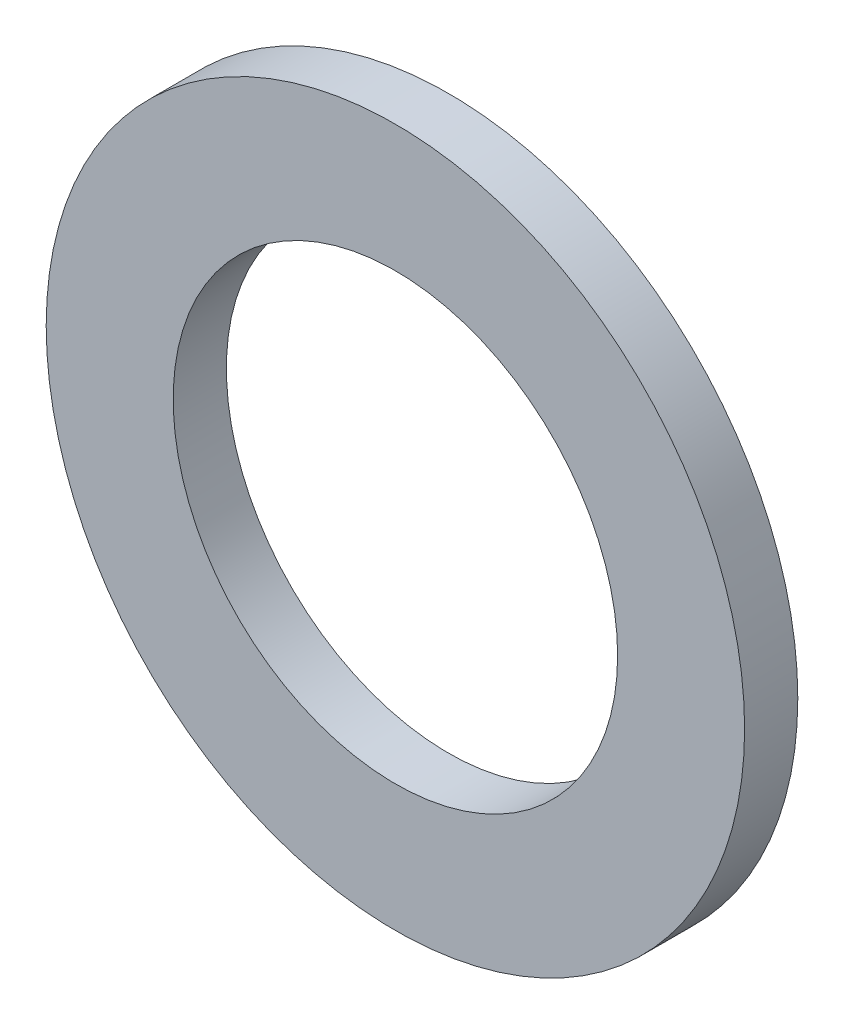
ISO-10303-21;
HEADER;
FILE_DESCRIPTION(('STEP AP214'),'2;1');
FILE_NAME('part.step','',(''),(''),'','','');
FILE_SCHEMA(('AUTOMOTIVE_DESIGN { 1 0 10303 214 1 1 1 1 }'));
ENDSEC;
DATA;
#1=APPLICATION_CONTEXT('core data for automotive mechanical design processes');
#2=APPLICATION_PROTOCOL_DEFINITION('international standard','automotive_design',2000,#1);
#3=PRODUCT_CONTEXT('',#1,'mechanical');
#4=PRODUCT('Part','Part','',(#3));
#5=PRODUCT_RELATED_PRODUCT_CATEGORY('part','',(#4));
#6=PRODUCT_DEFINITION_FORMATION('','',#4);
#7=PRODUCT_DEFINITION_CONTEXT('part definition',#1,'design');
#8=PRODUCT_DEFINITION('design','',#6,#7);
#9=PRODUCT_DEFINITION_SHAPE('','',#8);
#10=(LENGTH_UNIT() NAMED_UNIT(*) SI_UNIT(.MILLI.,.METRE.));
#11=(NAMED_UNIT(*) PLANE_ANGLE_UNIT() SI_UNIT($,.RADIAN.));
#12=(NAMED_UNIT(*) SI_UNIT($,.STERADIAN.) SOLID_ANGLE_UNIT());
#13=UNCERTAINTY_MEASURE_WITH_UNIT(LENGTH_MEASURE(1.E-05),#10,'distance_accuracy_value','');
#14=(GEOMETRIC_REPRESENTATION_CONTEXT(3) GLOBAL_UNCERTAINTY_ASSIGNED_CONTEXT((#13)) GLOBAL_UNIT_ASSIGNED_CONTEXT((#10,
#11,#12)) REPRESENTATION_CONTEXT('',''));
#15=CARTESIAN_POINT('',(0.,0.,0.));
#16=DIRECTION('',(0.,0.,1.));
#17=DIRECTION('',(1.,0.,0.));
#18=AXIS2_PLACEMENT_3D('',#15,#16,#17);
#19=CARTESIAN_POINT('',(0.,0.,3.015));
#20=DIRECTION('',(0.,0.,1.));
#21=DIRECTION('',(1.,0.,0.));
#22=AXIS2_PLACEMENT_3D('',#19,#20,#21);
#23=PLANE('',#22);
#24=CARTESIAN_POINT('',(0.,0.,3.015));
#25=DIRECTION('',(0.,0.,1.));
#26=DIRECTION('',(1.,0.,0.));
#27=AXIS2_PLACEMENT_3D('',#24,#25,#26);
#28=CIRCLE('',#27,17.6);
#29=CARTESIAN_POINT('',(17.6,0.,3.015));
#30=VERTEX_POINT('',#29);
#31=EDGE_CURVE('E11',#30,#30,#28,.T.);
#32=ORIENTED_EDGE('',*,*,#31,.T.);
#33=EDGE_LOOP('',(#32));
#34=FACE_BOUND('',#33,.T.);
#35=CARTESIAN_POINT('',(0.,0.,3.015));
#36=DIRECTION('',(0.,0.,1.));
#37=DIRECTION('',(1.,0.,0.));
#38=AXIS2_PLACEMENT_3D('',#35,#36,#37);
#39=CIRCLE('',#38,11.2);
#40=CARTESIAN_POINT('',(11.2,0.,3.015));
#41=VERTEX_POINT('',#40);
#42=EDGE_CURVE('E57',#41,#41,#39,.T.);
#43=ORIENTED_EDGE('',*,*,#42,.F.);
#44=EDGE_LOOP('',(#43));
#45=FACE_BOUND('',#44,.T.);
#46=ADVANCED_FACE('F44',(#34,#45),#23,.T.);
#47=CARTESIAN_POINT('',(0.,0.,0.335));
#48=DIRECTION('',(0.,0.,1.));
#49=DIRECTION('',(1.,0.,0.));
#50=AXIS2_PLACEMENT_3D('',#47,#48,#49);
#51=PLANE('',#50);
#52=CARTESIAN_POINT('',(0.,0.,0.335));
#53=DIRECTION('',(0.,0.,1.));
#54=DIRECTION('',(1.,0.,0.));
#55=AXIS2_PLACEMENT_3D('',#52,#53,#54);
#56=CIRCLE('',#55,17.6);
#57=CARTESIAN_POINT('',(17.6,0.,0.335));
#58=VERTEX_POINT('',#57);
#59=EDGE_CURVE('E48',#58,#58,#56,.T.);
#60=ORIENTED_EDGE('',*,*,#59,.F.);
#61=EDGE_LOOP('',(#60));
#62=FACE_BOUND('',#61,.T.);
#63=CARTESIAN_POINT('',(0.,0.,0.335));
#64=DIRECTION('',(0.,0.,1.));
#65=DIRECTION('',(1.,0.,0.));
#66=AXIS2_PLACEMENT_3D('',#63,#64,#65);
#67=CIRCLE('',#66,11.2);
#68=CARTESIAN_POINT('',(11.2,0.,0.335));
#69=VERTEX_POINT('',#68);
#70=EDGE_CURVE('E59',#69,#69,#67,.T.);
#71=ORIENTED_EDGE('',*,*,#70,.T.);
#72=EDGE_LOOP('',(#71));
#73=FACE_BOUND('',#72,.T.);
#74=ADVANCED_FACE('F71',(#62,#73),#51,.F.);
#75=CARTESIAN_POINT('',(0.,0.,3.015));
#76=DIRECTION('',(0.,0.,-1.));
#77=DIRECTION('',(-1.,0.,0.));
#78=AXIS2_PLACEMENT_3D('',#75,#76,#77);
#79=CYLINDRICAL_SURFACE('',#78,17.6);
#80=ORIENTED_EDGE('',*,*,#31,.F.);
#81=EDGE_LOOP('',(#80));
#82=FACE_BOUND('',#81,.T.);
#83=ORIENTED_EDGE('',*,*,#59,.T.);
#84=EDGE_LOOP('',(#83));
#85=FACE_BOUND('',#84,.T.);
#86=ADVANCED_FACE('F46',(#82,#85),#79,.T.);
#87=CARTESIAN_POINT('',(0.,0.,3.015));
#88=DIRECTION('',(0.,0.,-1.));
#89=DIRECTION('',(-1.,0.,0.));
#90=AXIS2_PLACEMENT_3D('',#87,#88,#89);
#91=CYLINDRICAL_SURFACE('',#90,11.2);
#92=ORIENTED_EDGE('',*,*,#42,.T.);
#93=EDGE_LOOP('',(#92));
#94=FACE_BOUND('',#93,.T.);
#95=ORIENTED_EDGE('',*,*,#70,.F.);
#96=EDGE_LOOP('',(#95));
#97=FACE_BOUND('',#96,.T.);
#98=ADVANCED_FACE('F67',(#94,#97),#91,.F.);
#99=CLOSED_SHELL('',(#46,#74,#86,#98));
#100=MANIFOLD_SOLID_BREP('B2',#99);
#101=ADVANCED_BREP_SHAPE_REPRESENTATION('',(#18,#100),#14);
#102=SHAPE_DEFINITION_REPRESENTATION(#9,#101);
ENDSEC;
END-ISO-10303-21;
